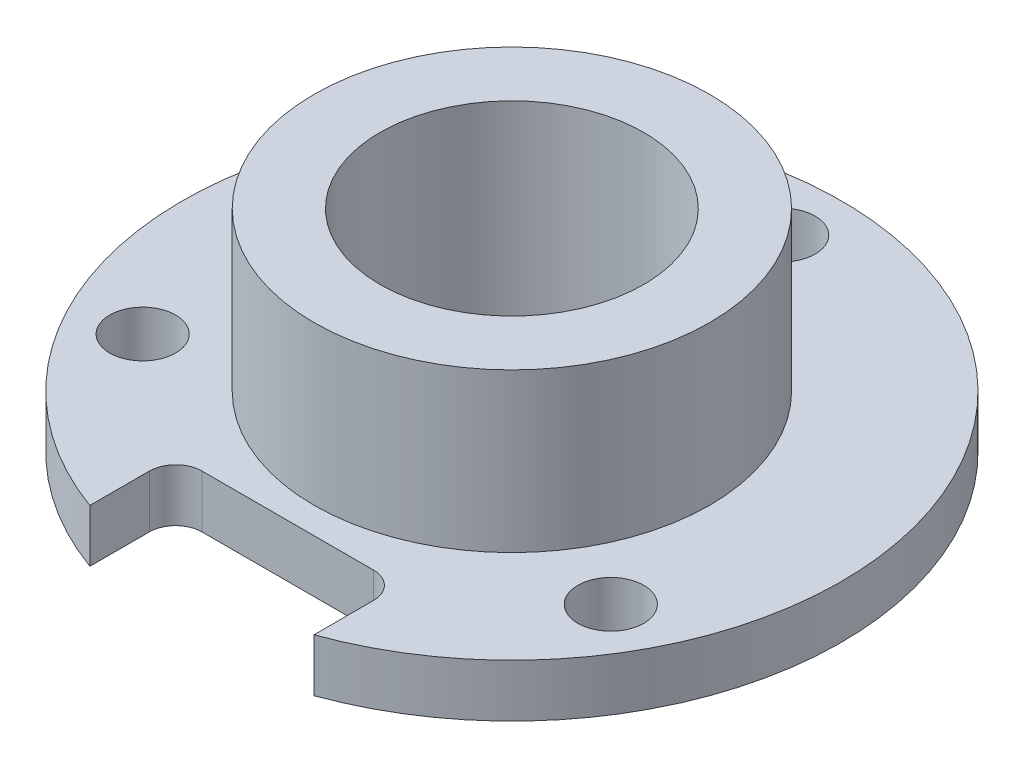
ISO-10303-21;
HEADER;
FILE_DESCRIPTION(('STEP AP214'),'2;1');
FILE_NAME('part.step','',(''),(''),'','','');
FILE_SCHEMA(('AUTOMOTIVE_DESIGN { 1 0 10303 214 1 1 1 1 }'));
ENDSEC;
DATA;
#1=APPLICATION_CONTEXT('core data for automotive mechanical design processes');
#2=APPLICATION_PROTOCOL_DEFINITION('international standard','automotive_design',2000,#1);
#3=PRODUCT_CONTEXT('',#1,'mechanical');
#4=PRODUCT('Part','Part','',(#3));
#5=PRODUCT_RELATED_PRODUCT_CATEGORY('part','',(#4));
#6=PRODUCT_DEFINITION_FORMATION('','',#4);
#7=PRODUCT_DEFINITION_CONTEXT('part definition',#1,'design');
#8=PRODUCT_DEFINITION('design','',#6,#7);
#9=PRODUCT_DEFINITION_SHAPE('','',#8);
#10=(LENGTH_UNIT() NAMED_UNIT(*) SI_UNIT(.MILLI.,.METRE.));
#11=(NAMED_UNIT(*) PLANE_ANGLE_UNIT() SI_UNIT($,.RADIAN.));
#12=(NAMED_UNIT(*) SI_UNIT($,.STERADIAN.) SOLID_ANGLE_UNIT());
#13=UNCERTAINTY_MEASURE_WITH_UNIT(LENGTH_MEASURE(1.E-05),#10,'distance_accuracy_value','');
#14=(GEOMETRIC_REPRESENTATION_CONTEXT(3) GLOBAL_UNCERTAINTY_ASSIGNED_CONTEXT((#13)) GLOBAL_UNIT_ASSIGNED_CONTEXT((#10,
#11,#12)) REPRESENTATION_CONTEXT('',''));
#15=CARTESIAN_POINT('',(0.,0.,0.));
#16=DIRECTION('',(0.,0.,1.));
#17=DIRECTION('',(1.,0.,0.));
#18=AXIS2_PLACEMENT_3D('',#15,#16,#17);
#19=CARTESIAN_POINT('',(0.,2.,0.));
#20=DIRECTION('',(0.,-1.,0.));
#21=DIRECTION('',(0.,0.,-1.));
#22=AXIS2_PLACEMENT_3D('',#19,#20,#21);
#23=CYLINDRICAL_SURFACE('',#22,12.5);
#24=DIRECTION('',(0.,-1.,0.));
#25=VECTOR('',#24,1.);
#26=CARTESIAN_POINT('',(-4.25,2.,11.7553179455087));
#27=LINE('',#26,#25);
#28=CARTESIAN_POINT('',(-4.25,2.,11.7553179455087));
#29=VERTEX_POINT('',#28);
#30=CARTESIAN_POINT('',(-4.25,0.,11.7553179455087));
#31=VERTEX_POINT('',#30);
#32=EDGE_CURVE('E137',#29,#31,#27,.T.);
#33=ORIENTED_EDGE('',*,*,#32,.F.);
#34=CARTESIAN_POINT('',(0.,2.,0.));
#35=DIRECTION('',(0.,1.,0.));
#36=DIRECTION('',(0.,0.,1.));
#37=AXIS2_PLACEMENT_3D('',#34,#35,#36);
#38=CIRCLE('',#37,12.5);
#39=CARTESIAN_POINT('',(4.25,2.,11.7553179455087));
#40=VERTEX_POINT('',#39);
#41=EDGE_CURVE('E11',#40,#29,#38,.T.);
#42=ORIENTED_EDGE('',*,*,#41,.F.);
#43=DIRECTION('',(0.,-1.,0.));
#44=VECTOR('',#43,1.);
#45=CARTESIAN_POINT('',(4.25,2.,11.7553179455087));
#46=LINE('',#45,#44);
#47=CARTESIAN_POINT('',(4.25,0.,11.7553179455087));
#48=VERTEX_POINT('',#47);
#49=EDGE_CURVE('E134',#40,#48,#46,.T.);
#50=ORIENTED_EDGE('',*,*,#49,.T.);
#51=CARTESIAN_POINT('',(0.,0.,0.));
#52=DIRECTION('',(0.,1.,0.));
#53=DIRECTION('',(0.,0.,1.));
#54=AXIS2_PLACEMENT_3D('',#51,#52,#53);
#55=CIRCLE('',#54,12.5);
#56=EDGE_CURVE('E46',#48,#31,#55,.T.);
#57=ORIENTED_EDGE('',*,*,#56,.T.);
#58=EDGE_LOOP('',(#33,#42,#50,#57));
#59=FACE_BOUND('',#58,.T.);
#60=ADVANCED_FACE('F43',(#59),#23,.T.);
#61=CARTESIAN_POINT('',(0.,2.,0.));
#62=DIRECTION('',(0.,1.,0.));
#63=DIRECTION('',(0.,0.,1.));
#64=AXIS2_PLACEMENT_3D('',#61,#62,#63);
#65=PLANE('',#64);
#66=CARTESIAN_POINT('',(0.,2.,-10.25));
#67=DIRECTION('',(0.,1.,0.));
#68=DIRECTION('',(0.,0.,1.));
#69=AXIS2_PLACEMENT_3D('',#66,#67,#68);
#70=CIRCLE('',#69,1.25);
#71=CARTESIAN_POINT('',(0.,2.,-9.));
#72=VERTEX_POINT('',#71);
#73=EDGE_CURVE('E119',#72,#72,#70,.T.);
#74=ORIENTED_EDGE('',*,*,#73,.F.);
#75=EDGE_LOOP('',(#74));
#76=FACE_BOUND('',#75,.T.);
#77=CARTESIAN_POINT('',(8.8767603887905,2.,5.125));
#78=DIRECTION('',(0.,1.,0.));
#79=DIRECTION('',(0.,0.,1.));
#80=AXIS2_PLACEMENT_3D('',#77,#78,#79);
#81=CIRCLE('',#80,1.25);
#82=CARTESIAN_POINT('',(8.8767603887905,2.,6.375));
#83=VERTEX_POINT('',#82);
#84=EDGE_CURVE('E173',#83,#83,#81,.T.);
#85=ORIENTED_EDGE('',*,*,#84,.F.);
#86=EDGE_LOOP('',(#85));
#87=FACE_BOUND('',#86,.T.);
#88=CARTESIAN_POINT('',(-8.8767603887905,2.,5.125));
#89=DIRECTION('',(0.,1.,0.));
#90=DIRECTION('',(0.,0.,1.));
#91=AXIS2_PLACEMENT_3D('',#88,#89,#90);
#92=CIRCLE('',#91,1.25);
#93=CARTESIAN_POINT('',(-8.8767603887905,2.,6.375));
#94=VERTEX_POINT('',#93);
#95=EDGE_CURVE('E166',#94,#94,#92,.T.);
#96=ORIENTED_EDGE('',*,*,#95,.F.);
#97=EDGE_LOOP('',(#96));
#98=FACE_BOUND('',#97,.T.);
#99=CARTESIAN_POINT('',(0.,2.,0.));
#100=DIRECTION('',(0.,1.,0.));
#101=DIRECTION('',(0.,0.,1.));
#102=AXIS2_PLACEMENT_3D('',#99,#100,#101);
#103=CIRCLE('',#102,7.5);
#104=CARTESIAN_POINT('',(0.,2.,7.5));
#105=VERTEX_POINT('',#104);
#106=EDGE_CURVE('E51',#105,#105,#103,.T.);
#107=ORIENTED_EDGE('',*,*,#106,.F.);
#108=EDGE_LOOP('',(#107));
#109=FACE_BOUND('',#108,.T.);
#110=ORIENTED_EDGE('',*,*,#41,.T.);
#111=DIRECTION('',(0.,0.,-1.));
#112=VECTOR('',#111,1.);
#113=CARTESIAN_POINT('',(-4.25,2.,13.5));
#114=LINE('',#113,#112);
#115=CARTESIAN_POINT('',(-4.25,2.,9.50000000000001));
#116=VERTEX_POINT('',#115);
#117=EDGE_CURVE('E66',#29,#116,#114,.T.);
#118=ORIENTED_EDGE('',*,*,#117,.T.);
#119=CARTESIAN_POINT('',(-3.25,2.,9.5));
#120=DIRECTION('',(0.,-1.,0.));
#121=DIRECTION('',(0.,0.,-1.));
#122=AXIS2_PLACEMENT_3D('',#119,#120,#121);
#123=CIRCLE('',#122,1.);
#124=CARTESIAN_POINT('',(-3.24999999999999,2.,8.5));
#125=VERTEX_POINT('',#124);
#126=EDGE_CURVE('E105',#116,#125,#123,.T.);
#127=ORIENTED_EDGE('',*,*,#126,.T.);
#128=DIRECTION('',(1.,0.,0.));
#129=VECTOR('',#128,1.);
#130=CARTESIAN_POINT('',(-3.24999999999999,2.,8.5));
#131=LINE('',#130,#129);
#132=CARTESIAN_POINT('',(3.24999999999999,2.,8.5));
#133=VERTEX_POINT('',#132);
#134=EDGE_CURVE('E111',#125,#133,#131,.T.);
#135=ORIENTED_EDGE('',*,*,#134,.T.);
#136=CARTESIAN_POINT('',(3.25,2.,9.5));
#137=DIRECTION('',(0.,-1.,0.));
#138=DIRECTION('',(0.,0.,-1.));
#139=AXIS2_PLACEMENT_3D('',#136,#137,#138);
#140=CIRCLE('',#139,1.);
#141=CARTESIAN_POINT('',(4.25,2.,9.50000000000001));
#142=VERTEX_POINT('',#141);
#143=EDGE_CURVE('E125',#133,#142,#140,.T.);
#144=ORIENTED_EDGE('',*,*,#143,.T.);
#145=DIRECTION('',(0.,0.,-1.));
#146=VECTOR('',#145,1.);
#147=CARTESIAN_POINT('',(4.25,2.,13.5));
#148=LINE('',#147,#146);
#149=EDGE_CURVE('E128',#40,#142,#148,.T.);
#150=ORIENTED_EDGE('',*,*,#149,.F.);
#151=EDGE_LOOP('',(#110,#118,#127,#135,#144,#150));
#152=FACE_BOUND('',#151,.T.);
#153=ADVANCED_FACE('F113',(#76,#87,#98,#109,#152),#65,.T.);
#154=CARTESIAN_POINT('',(0.,0.,0.));
#155=DIRECTION('',(0.,1.,0.));
#156=DIRECTION('',(0.,0.,1.));
#157=AXIS2_PLACEMENT_3D('',#154,#155,#156);
#158=PLANE('',#157);
#159=CARTESIAN_POINT('',(0.,0.,-10.25));
#160=DIRECTION('',(0.,1.,0.));
#161=DIRECTION('',(0.,0.,1.));
#162=AXIS2_PLACEMENT_3D('',#159,#160,#161);
#163=CIRCLE('',#162,1.25);
#164=CARTESIAN_POINT('',(0.,0.,-9.));
#165=VERTEX_POINT('',#164);
#166=EDGE_CURVE('E116',#165,#165,#163,.F.);
#167=ORIENTED_EDGE('',*,*,#166,.F.);
#168=EDGE_LOOP('',(#167));
#169=FACE_BOUND('',#168,.T.);
#170=CARTESIAN_POINT('',(8.8767603887905,0.,5.125));
#171=DIRECTION('',(0.,1.,0.));
#172=DIRECTION('',(0.,0.,1.));
#173=AXIS2_PLACEMENT_3D('',#170,#171,#172);
#174=CIRCLE('',#173,1.25);
#175=CARTESIAN_POINT('',(8.8767603887905,0.,6.375));
#176=VERTEX_POINT('',#175);
#177=EDGE_CURVE('E169',#176,#176,#174,.F.);
#178=ORIENTED_EDGE('',*,*,#177,.F.);
#179=EDGE_LOOP('',(#178));
#180=FACE_BOUND('',#179,.T.);
#181=CARTESIAN_POINT('',(-8.8767603887905,0.,5.125));
#182=DIRECTION('',(0.,1.,0.));
#183=DIRECTION('',(0.,0.,1.));
#184=AXIS2_PLACEMENT_3D('',#181,#182,#183);
#185=CIRCLE('',#184,1.25);
#186=CARTESIAN_POINT('',(-8.8767603887905,0.,6.375));
#187=VERTEX_POINT('',#186);
#188=EDGE_CURVE('E170',#187,#187,#185,.F.);
#189=ORIENTED_EDGE('',*,*,#188,.F.);
#190=EDGE_LOOP('',(#189));
#191=FACE_BOUND('',#190,.T.);
#192=CARTESIAN_POINT('',(0.,0.,0.));
#193=DIRECTION('',(0.,1.,0.));
#194=DIRECTION('',(0.,0.,1.));
#195=AXIS2_PLACEMENT_3D('',#192,#193,#194);
#196=CIRCLE('',#195,5.);
#197=CARTESIAN_POINT('',(0.,0.,5.));
#198=VERTEX_POINT('',#197);
#199=EDGE_CURVE('E139',#198,#198,#196,.T.);
#200=ORIENTED_EDGE('',*,*,#199,.T.);
#201=EDGE_LOOP('',(#200));
#202=FACE_BOUND('',#201,.T.);
#203=DIRECTION('',(0.,0.,1.));
#204=VECTOR('',#203,1.);
#205=CARTESIAN_POINT('',(-4.25,0.,13.5));
#206=LINE('',#205,#204);
#207=CARTESIAN_POINT('',(-4.25,0.,9.50000000000001));
#208=VERTEX_POINT('',#207);
#209=EDGE_CURVE('E98',#208,#31,#206,.T.);
#210=ORIENTED_EDGE('',*,*,#209,.T.);
#211=ORIENTED_EDGE('',*,*,#56,.F.);
#212=DIRECTION('',(0.,0.,1.));
#213=VECTOR('',#212,1.);
#214=CARTESIAN_POINT('',(4.25,0.,13.5));
#215=LINE('',#214,#213);
#216=CARTESIAN_POINT('',(4.25,0.,9.50000000000001));
#217=VERTEX_POINT('',#216);
#218=EDGE_CURVE('E101',#217,#48,#215,.T.);
#219=ORIENTED_EDGE('',*,*,#218,.F.);
#220=CARTESIAN_POINT('',(3.25,0.,9.5));
#221=DIRECTION('',(0.,1.,0.));
#222=DIRECTION('',(0.,0.,1.));
#223=AXIS2_PLACEMENT_3D('',#220,#221,#222);
#224=CIRCLE('',#223,1.);
#225=CARTESIAN_POINT('',(3.24999999999999,0.,8.5));
#226=VERTEX_POINT('',#225);
#227=EDGE_CURVE('E161',#217,#226,#224,.T.);
#228=ORIENTED_EDGE('',*,*,#227,.T.);
#229=DIRECTION('',(-1.,0.,0.));
#230=VECTOR('',#229,1.);
#231=CARTESIAN_POINT('',(-3.24999999999999,0.,8.5));
#232=LINE('',#231,#230);
#233=CARTESIAN_POINT('',(-3.24999999999999,0.,8.5));
#234=VERTEX_POINT('',#233);
#235=EDGE_CURVE('E160',#226,#234,#232,.T.);
#236=ORIENTED_EDGE('',*,*,#235,.T.);
#237=CARTESIAN_POINT('',(-3.25,0.,9.5));
#238=DIRECTION('',(0.,1.,0.));
#239=DIRECTION('',(0.,0.,1.));
#240=AXIS2_PLACEMENT_3D('',#237,#238,#239);
#241=CIRCLE('',#240,1.);
#242=EDGE_CURVE('E159',#234,#208,#241,.T.);
#243=ORIENTED_EDGE('',*,*,#242,.T.);
#244=EDGE_LOOP('',(#210,#211,#219,#228,#236,#243));
#245=FACE_BOUND('',#244,.T.);
#246=ADVANCED_FACE('F156',(#169,#180,#191,#202,#245),#158,.F.);
#247=CARTESIAN_POINT('',(0.,8.,0.));
#248=DIRECTION('',(0.,-1.,0.));
#249=DIRECTION('',(0.,0.,-1.));
#250=AXIS2_PLACEMENT_3D('',#247,#248,#249);
#251=CYLINDRICAL_SURFACE('',#250,5.);
#252=CARTESIAN_POINT('',(0.,8.,0.));
#253=DIRECTION('',(0.,1.,0.));
#254=DIRECTION('',(0.,0.,1.));
#255=AXIS2_PLACEMENT_3D('',#252,#253,#254);
#256=CIRCLE('',#255,5.);
#257=CARTESIAN_POINT('',(0.,8.,5.));
#258=VERTEX_POINT('',#257);
#259=EDGE_CURVE('E140',#258,#258,#256,.T.);
#260=ORIENTED_EDGE('',*,*,#259,.T.);
#261=EDGE_LOOP('',(#260));
#262=FACE_BOUND('',#261,.T.);
#263=ORIENTED_EDGE('',*,*,#199,.F.);
#264=EDGE_LOOP('',(#263));
#265=FACE_BOUND('',#264,.T.);
#266=ADVANCED_FACE('F258',(#262,#265),#251,.F.);
#267=CARTESIAN_POINT('',(0.,8.,0.));
#268=DIRECTION('',(0.,-1.,0.));
#269=DIRECTION('',(0.,0.,-1.));
#270=AXIS2_PLACEMENT_3D('',#267,#268,#269);
#271=CYLINDRICAL_SURFACE('',#270,7.5);
#272=ORIENTED_EDGE('',*,*,#106,.T.);
#273=EDGE_LOOP('',(#272));
#274=FACE_BOUND('',#273,.T.);
#275=CARTESIAN_POINT('',(0.,8.,0.));
#276=DIRECTION('',(0.,1.,0.));
#277=DIRECTION('',(0.,0.,1.));
#278=AXIS2_PLACEMENT_3D('',#275,#276,#277);
#279=CIRCLE('',#278,7.5);
#280=CARTESIAN_POINT('',(0.,8.,7.5));
#281=VERTEX_POINT('',#280);
#282=EDGE_CURVE('E143',#281,#281,#279,.T.);
#283=ORIENTED_EDGE('',*,*,#282,.F.);
#284=EDGE_LOOP('',(#283));
#285=FACE_BOUND('',#284,.T.);
#286=ADVANCED_FACE('F268',(#274,#285),#271,.T.);
#287=CARTESIAN_POINT('',(0.,8.,0.));
#288=DIRECTION('',(0.,1.,0.));
#289=DIRECTION('',(0.,0.,1.));
#290=AXIS2_PLACEMENT_3D('',#287,#288,#289);
#291=PLANE('',#290);
#292=ORIENTED_EDGE('',*,*,#259,.F.);
#293=EDGE_LOOP('',(#292));
#294=FACE_BOUND('',#293,.T.);
#295=ORIENTED_EDGE('',*,*,#282,.T.);
#296=EDGE_LOOP('',(#295));
#297=FACE_BOUND('',#296,.T.);
#298=ADVANCED_FACE('F217',(#294,#297),#291,.T.);
#299=CARTESIAN_POINT('',(-4.25,-9.86154146165801,13.5));
#300=DIRECTION('',(1.,0.,0.));
#301=DIRECTION('',(0.,0.,-1.));
#302=AXIS2_PLACEMENT_3D('',#299,#300,#301);
#303=PLANE('',#302);
#304=ORIENTED_EDGE('',*,*,#32,.T.);
#305=ORIENTED_EDGE('',*,*,#209,.F.);
#306=DIRECTION('',(0.,1.,0.));
#307=VECTOR('',#306,1.);
#308=CARTESIAN_POINT('',(-4.25,-9.86154146165801,9.50000000000001));
#309=LINE('',#308,#307);
#310=EDGE_CURVE('E94',#208,#116,#309,.T.);
#311=ORIENTED_EDGE('',*,*,#310,.T.);
#312=ORIENTED_EDGE('',*,*,#117,.F.);
#313=EDGE_LOOP('',(#304,#305,#311,#312));
#314=FACE_BOUND('',#313,.T.);
#315=ADVANCED_FACE('F96',(#314),#303,.T.);
#316=CARTESIAN_POINT('',(4.25,-9.86154146165801,13.5));
#317=DIRECTION('',(1.,0.,0.));
#318=DIRECTION('',(0.,0.,-1.));
#319=AXIS2_PLACEMENT_3D('',#316,#317,#318);
#320=PLANE('',#319);
#321=ORIENTED_EDGE('',*,*,#149,.T.);
#322=DIRECTION('',(0.,1.,0.));
#323=VECTOR('',#322,1.);
#324=CARTESIAN_POINT('',(4.25,-9.86154146165801,9.50000000000001));
#325=LINE('',#324,#323);
#326=EDGE_CURVE('E58',#217,#142,#325,.T.);
#327=ORIENTED_EDGE('',*,*,#326,.F.);
#328=ORIENTED_EDGE('',*,*,#218,.T.);
#329=ORIENTED_EDGE('',*,*,#49,.F.);
#330=EDGE_LOOP('',(#321,#327,#328,#329));
#331=FACE_BOUND('',#330,.T.);
#332=ADVANCED_FACE('F224',(#331),#320,.F.);
#333=CARTESIAN_POINT('',(-3.25,-9.86154146165801,9.5));
#334=DIRECTION('',(0.,1.,0.));
#335=DIRECTION('',(0.,0.,1.));
#336=AXIS2_PLACEMENT_3D('',#333,#334,#335);
#337=CYLINDRICAL_SURFACE('',#336,1.);
#338=DIRECTION('',(0.,1.,0.));
#339=VECTOR('',#338,1.);
#340=CARTESIAN_POINT('',(-3.24999999999999,-9.86154146165801,8.5));
#341=LINE('',#340,#339);
#342=EDGE_CURVE('E102',#234,#125,#341,.T.);
#343=ORIENTED_EDGE('',*,*,#342,.T.);
#344=ORIENTED_EDGE('',*,*,#126,.F.);
#345=ORIENTED_EDGE('',*,*,#310,.F.);
#346=ORIENTED_EDGE('',*,*,#242,.F.);
#347=EDGE_LOOP('',(#343,#344,#345,#346));
#348=FACE_BOUND('',#347,.T.);
#349=ADVANCED_FACE('F106',(#348),#337,.F.);
#350=CARTESIAN_POINT('',(-3.24999999999999,-9.86154146165801,8.5));
#351=DIRECTION('',(0.,0.,1.));
#352=DIRECTION('',(1.,0.,0.));
#353=AXIS2_PLACEMENT_3D('',#350,#351,#352);
#354=PLANE('',#353);
#355=DIRECTION('',(0.,1.,0.));
#356=VECTOR('',#355,1.);
#357=CARTESIAN_POINT('',(3.24999999999999,-9.86154146165801,8.5));
#358=LINE('',#357,#356);
#359=EDGE_CURVE('E131',#226,#133,#358,.T.);
#360=ORIENTED_EDGE('',*,*,#359,.T.);
#361=ORIENTED_EDGE('',*,*,#134,.F.);
#362=ORIENTED_EDGE('',*,*,#342,.F.);
#363=ORIENTED_EDGE('',*,*,#235,.F.);
#364=EDGE_LOOP('',(#360,#361,#362,#363));
#365=FACE_BOUND('',#364,.T.);
#366=ADVANCED_FACE('F204',(#365),#354,.T.);
#367=CARTESIAN_POINT('',(3.25,-9.86154146165801,9.5));
#368=DIRECTION('',(0.,1.,0.));
#369=DIRECTION('',(0.,0.,1.));
#370=AXIS2_PLACEMENT_3D('',#367,#368,#369);
#371=CYLINDRICAL_SURFACE('',#370,1.);
#372=ORIENTED_EDGE('',*,*,#326,.T.);
#373=ORIENTED_EDGE('',*,*,#143,.F.);
#374=ORIENTED_EDGE('',*,*,#359,.F.);
#375=ORIENTED_EDGE('',*,*,#227,.F.);
#376=EDGE_LOOP('',(#372,#373,#374,#375));
#377=FACE_BOUND('',#376,.T.);
#378=ADVANCED_FACE('F194',(#377),#371,.F.);
#379=CARTESIAN_POINT('',(-8.8767603887905,-3.53553390593274,5.125));
#380=DIRECTION('',(0.,1.,0.));
#381=DIRECTION('',(0.,0.,1.));
#382=AXIS2_PLACEMENT_3D('',#379,#380,#381);
#383=CYLINDRICAL_SURFACE('',#382,1.25);
#384=ORIENTED_EDGE('',*,*,#188,.T.);
#385=EDGE_LOOP('',(#384));
#386=FACE_BOUND('',#385,.T.);
#387=ORIENTED_EDGE('',*,*,#95,.T.);
#388=EDGE_LOOP('',(#387));
#389=FACE_BOUND('',#388,.T.);
#390=ADVANCED_FACE('F191',(#386,#389),#383,.F.);
#391=CARTESIAN_POINT('',(8.8767603887905,-3.53553390593274,5.125));
#392=DIRECTION('',(0.,1.,0.));
#393=DIRECTION('',(0.,0.,1.));
#394=AXIS2_PLACEMENT_3D('',#391,#392,#393);
#395=CYLINDRICAL_SURFACE('',#394,1.25);
#396=ORIENTED_EDGE('',*,*,#177,.T.);
#397=EDGE_LOOP('',(#396));
#398=FACE_BOUND('',#397,.T.);
#399=ORIENTED_EDGE('',*,*,#84,.T.);
#400=EDGE_LOOP('',(#399));
#401=FACE_BOUND('',#400,.T.);
#402=ADVANCED_FACE('F193',(#398,#401),#395,.F.);
#403=CARTESIAN_POINT('',(0.,-3.53553390593274,-10.25));
#404=DIRECTION('',(0.,1.,0.));
#405=DIRECTION('',(0.,0.,1.));
#406=AXIS2_PLACEMENT_3D('',#403,#404,#405);
#407=CYLINDRICAL_SURFACE('',#406,1.25);
#408=ORIENTED_EDGE('',*,*,#166,.T.);
#409=EDGE_LOOP('',(#408));
#410=FACE_BOUND('',#409,.T.);
#411=ORIENTED_EDGE('',*,*,#73,.T.);
#412=EDGE_LOOP('',(#411));
#413=FACE_BOUND('',#412,.T.);
#414=ADVANCED_FACE('F181',(#410,#413),#407,.F.);
#415=CLOSED_SHELL('',(#60,#153,#246,#266,#286,#298,#315,#332,#349,#366,#378,#390,#402,#414));
#416=MANIFOLD_SOLID_BREP('B2',#415);
#417=ADVANCED_BREP_SHAPE_REPRESENTATION('',(#18,#416),#14);
#418=SHAPE_DEFINITION_REPRESENTATION(#9,#417);
ENDSEC;
END-ISO-10303-21;
